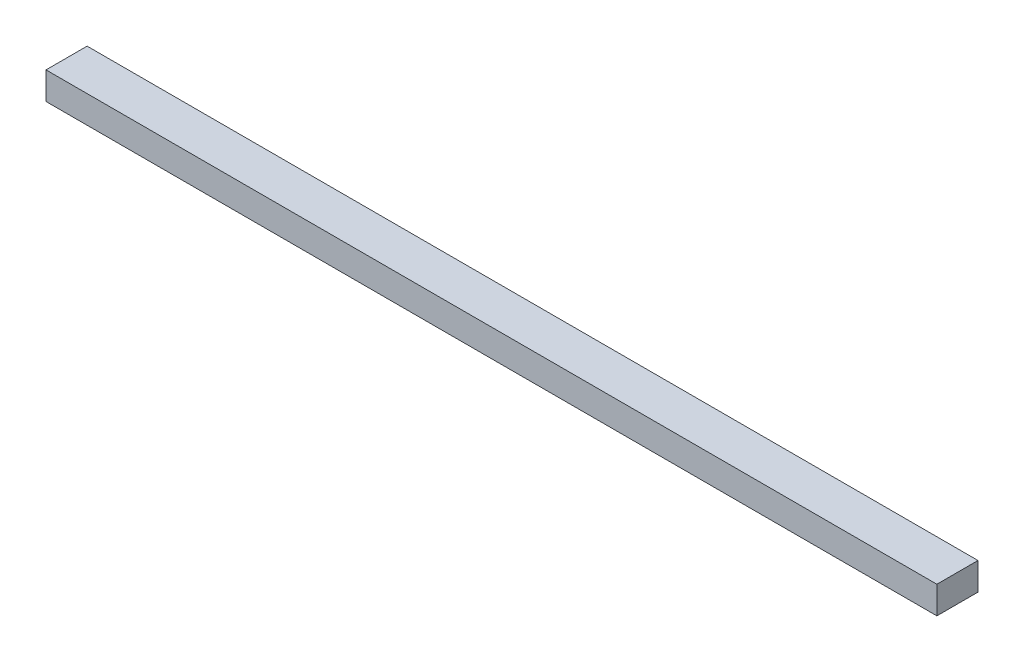
ISO-10303-21;
HEADER;
FILE_DESCRIPTION(('STEP AP214'),'2;1');
FILE_NAME('part.step','',(''),(''),'','','');
FILE_SCHEMA(('AUTOMOTIVE_DESIGN { 1 0 10303 214 1 1 1 1 }'));
ENDSEC;
DATA;
#1=APPLICATION_CONTEXT('core data for automotive mechanical design processes');
#2=APPLICATION_PROTOCOL_DEFINITION('international standard','automotive_design',2000,#1);
#3=PRODUCT_CONTEXT('',#1,'mechanical');
#4=PRODUCT('Part','Part','',(#3));
#5=PRODUCT_RELATED_PRODUCT_CATEGORY('part','',(#4));
#6=PRODUCT_DEFINITION_FORMATION('','',#4);
#7=PRODUCT_DEFINITION_CONTEXT('part definition',#1,'design');
#8=PRODUCT_DEFINITION('design','',#6,#7);
#9=PRODUCT_DEFINITION_SHAPE('','',#8);
#10=(LENGTH_UNIT() NAMED_UNIT(*) SI_UNIT(.MILLI.,.METRE.));
#11=(NAMED_UNIT(*) PLANE_ANGLE_UNIT() SI_UNIT($,.RADIAN.));
#12=(NAMED_UNIT(*) SI_UNIT($,.STERADIAN.) SOLID_ANGLE_UNIT());
#13=UNCERTAINTY_MEASURE_WITH_UNIT(LENGTH_MEASURE(1.E-05),#10,'distance_accuracy_value','');
#14=(GEOMETRIC_REPRESENTATION_CONTEXT(3) GLOBAL_UNCERTAINTY_ASSIGNED_CONTEXT((#13)) GLOBAL_UNIT_ASSIGNED_CONTEXT((#10,
#11,#12)) REPRESENTATION_CONTEXT('',''));
#15=CARTESIAN_POINT('',(0.,0.,0.));
#16=DIRECTION('',(0.,0.,1.));
#17=DIRECTION('',(1.,0.,0.));
#18=AXIS2_PLACEMENT_3D('',#15,#16,#17);
#19=CARTESIAN_POINT('',(121.304317470741,-14.5,16.4893350899219));
#20=DIRECTION('',(0.,-1.,0.));
#21=DIRECTION('',(0.,0.,-1.));
#22=AXIS2_PLACEMENT_3D('',#19,#20,#21);
#23=PLANE('',#22);
#24=DIRECTION('',(0.,0.,1.));
#25=VECTOR('',#24,1.);
#26=CARTESIAN_POINT('',(88.8043174707413,-14.5,26.4893350899219));
#27=LINE('',#26,#25);
#28=CARTESIAN_POINT('',(88.8043174707413,-14.5,24.9893350899219));
#29=VERTEX_POINT('',#28);
#30=CARTESIAN_POINT('',(88.8043174707413,-14.5,27.9893350899219));
#31=VERTEX_POINT('',#30);
#32=EDGE_CURVE('E105',#29,#31,#27,.T.);
#33=ORIENTED_EDGE('',*,*,#32,.F.);
#34=DIRECTION('',(1.,0.,0.));
#35=VECTOR('',#34,1.);
#36=CARTESIAN_POINT('',(121.304317470741,-14.5,24.9893350899219));
#37=LINE('',#36,#35);
#38=CARTESIAN_POINT('',(153.804317470741,-14.5,24.9893350899219));
#39=VERTEX_POINT('',#38);
#40=EDGE_CURVE('E71',#29,#39,#37,.T.);
#41=ORIENTED_EDGE('',*,*,#40,.T.);
#42=DIRECTION('',(0.,0.,1.));
#43=VECTOR('',#42,1.);
#44=CARTESIAN_POINT('',(153.804317470741,-14.5,26.4893350899219));
#45=LINE('',#44,#43);
#46=CARTESIAN_POINT('',(153.804317470741,-14.5,27.9893350899219));
#47=VERTEX_POINT('',#46);
#48=EDGE_CURVE('E86',#39,#47,#45,.T.);
#49=ORIENTED_EDGE('',*,*,#48,.T.);
#50=DIRECTION('',(1.,0.,0.));
#51=VECTOR('',#50,1.);
#52=CARTESIAN_POINT('',(121.304317470741,-14.5,27.9893350899219));
#53=LINE('',#52,#51);
#54=EDGE_CURVE('E27',#31,#47,#53,.T.);
#55=ORIENTED_EDGE('',*,*,#54,.F.);
#56=EDGE_LOOP('',(#33,#41,#49,#55));
#57=FACE_BOUND('',#56,.T.);
#58=ADVANCED_FACE('F16',(#57),#23,.T.);
#59=CARTESIAN_POINT('',(121.304317470741,-12.5,16.4893350899219));
#60=DIRECTION('',(0.,-1.,0.));
#61=DIRECTION('',(0.,0.,-1.));
#62=AXIS2_PLACEMENT_3D('',#59,#60,#61);
#63=PLANE('',#62);
#64=DIRECTION('',(0.,0.,1.));
#65=VECTOR('',#64,1.);
#66=CARTESIAN_POINT('',(88.8043174707413,-12.5,26.4893350899219));
#67=LINE('',#66,#65);
#68=CARTESIAN_POINT('',(88.8043174707413,-12.5,24.9893350899219));
#69=VERTEX_POINT('',#68);
#70=CARTESIAN_POINT('',(88.8043174707413,-12.5,27.9893350899219));
#71=VERTEX_POINT('',#70);
#72=EDGE_CURVE('E20',#69,#71,#67,.T.);
#73=ORIENTED_EDGE('',*,*,#72,.T.);
#74=DIRECTION('',(1.,0.,0.));
#75=VECTOR('',#74,1.);
#76=CARTESIAN_POINT('',(121.304317470741,-12.5,27.9893350899219));
#77=LINE('',#76,#75);
#78=CARTESIAN_POINT('',(153.804317470741,-12.5,27.9893350899219));
#79=VERTEX_POINT('',#78);
#80=EDGE_CURVE('E11',#71,#79,#77,.T.);
#81=ORIENTED_EDGE('',*,*,#80,.T.);
#82=DIRECTION('',(0.,0.,1.));
#83=VECTOR('',#82,1.);
#84=CARTESIAN_POINT('',(153.804317470741,-12.5,26.4893350899219));
#85=LINE('',#84,#83);
#86=CARTESIAN_POINT('',(153.804317470741,-12.5,24.9893350899219));
#87=VERTEX_POINT('',#86);
#88=EDGE_CURVE('E77',#87,#79,#85,.T.);
#89=ORIENTED_EDGE('',*,*,#88,.F.);
#90=DIRECTION('',(1.,0.,0.));
#91=VECTOR('',#90,1.);
#92=CARTESIAN_POINT('',(121.304317470741,-12.5,24.9893350899219));
#93=LINE('',#92,#91);
#94=EDGE_CURVE('E81',#69,#87,#93,.T.);
#95=ORIENTED_EDGE('',*,*,#94,.F.);
#96=EDGE_LOOP('',(#73,#81,#89,#95));
#97=FACE_BOUND('',#96,.T.);
#98=ADVANCED_FACE('F79',(#97),#63,.F.);
#99=CARTESIAN_POINT('',(121.304317470741,-12.5,27.9893350899219));
#100=DIRECTION('',(0.,0.,-1.));
#101=DIRECTION('',(0.,-1.,0.));
#102=AXIS2_PLACEMENT_3D('',#99,#100,#101);
#103=PLANE('',#102);
#104=ORIENTED_EDGE('',*,*,#54,.T.);
#105=DIRECTION('',(0.,-1.,0.));
#106=VECTOR('',#105,1.);
#107=CARTESIAN_POINT('',(153.804317470741,-12.5,27.9893350899219));
#108=LINE('',#107,#106);
#109=EDGE_CURVE('E85',#79,#47,#108,.T.);
#110=ORIENTED_EDGE('',*,*,#109,.F.);
#111=ORIENTED_EDGE('',*,*,#80,.F.);
#112=DIRECTION('',(0.,-1.,0.));
#113=VECTOR('',#112,1.);
#114=CARTESIAN_POINT('',(88.8043174707413,-12.5,27.9893350899219));
#115=LINE('',#114,#113);
#116=EDGE_CURVE('E108',#71,#31,#115,.T.);
#117=ORIENTED_EDGE('',*,*,#116,.T.);
#118=EDGE_LOOP('',(#104,#110,#111,#117));
#119=FACE_BOUND('',#118,.T.);
#120=ADVANCED_FACE('F18',(#119),#103,.F.);
#121=CARTESIAN_POINT('',(153.804317470741,-12.5,26.4893350899219));
#122=DIRECTION('',(1.,0.,0.));
#123=DIRECTION('',(0.,1.,0.));
#124=AXIS2_PLACEMENT_3D('',#121,#122,#123);
#125=PLANE('',#124);
#126=ORIENTED_EDGE('',*,*,#48,.F.);
#127=DIRECTION('',(0.,-1.,0.));
#128=VECTOR('',#127,1.);
#129=CARTESIAN_POINT('',(153.804317470741,-12.5,24.9893350899219));
#130=LINE('',#129,#128);
#131=EDGE_CURVE('E88',#87,#39,#130,.T.);
#132=ORIENTED_EDGE('',*,*,#131,.F.);
#133=ORIENTED_EDGE('',*,*,#88,.T.);
#134=ORIENTED_EDGE('',*,*,#109,.T.);
#135=EDGE_LOOP('',(#126,#132,#133,#134));
#136=FACE_BOUND('',#135,.T.);
#137=ADVANCED_FACE('F89',(#136),#125,.T.);
#138=CARTESIAN_POINT('',(121.304317470741,-12.5,24.9893350899219));
#139=DIRECTION('',(0.,0.,-1.));
#140=DIRECTION('',(0.,-1.,0.));
#141=AXIS2_PLACEMENT_3D('',#138,#139,#140);
#142=PLANE('',#141);
#143=ORIENTED_EDGE('',*,*,#40,.F.);
#144=DIRECTION('',(0.,-1.,0.));
#145=VECTOR('',#144,1.);
#146=CARTESIAN_POINT('',(88.8043174707413,-12.5,24.9893350899219));
#147=LINE('',#146,#145);
#148=EDGE_CURVE('E93',#69,#29,#147,.T.);
#149=ORIENTED_EDGE('',*,*,#148,.F.);
#150=ORIENTED_EDGE('',*,*,#94,.T.);
#151=ORIENTED_EDGE('',*,*,#131,.T.);
#152=EDGE_LOOP('',(#143,#149,#150,#151));
#153=FACE_BOUND('',#152,.T.);
#154=ADVANCED_FACE('F92',(#153),#142,.T.);
#155=CARTESIAN_POINT('',(88.8043174707413,-12.5,26.4893350899219));
#156=DIRECTION('',(1.,0.,0.));
#157=DIRECTION('',(0.,1.,0.));
#158=AXIS2_PLACEMENT_3D('',#155,#156,#157);
#159=PLANE('',#158);
#160=ORIENTED_EDGE('',*,*,#32,.T.);
#161=ORIENTED_EDGE('',*,*,#116,.F.);
#162=ORIENTED_EDGE('',*,*,#72,.F.);
#163=ORIENTED_EDGE('',*,*,#148,.T.);
#164=EDGE_LOOP('',(#160,#161,#162,#163));
#165=FACE_BOUND('',#164,.T.);
#166=ADVANCED_FACE('F121',(#165),#159,.F.);
#167=CLOSED_SHELL('',(#58,#98,#120,#137,#154,#166));
#168=MANIFOLD_SOLID_BREP('B1',#167);
#169=ADVANCED_BREP_SHAPE_REPRESENTATION('',(#18,#168),#14);
#170=SHAPE_DEFINITION_REPRESENTATION(#9,#169);
ENDSEC;
END-ISO-10303-21;
